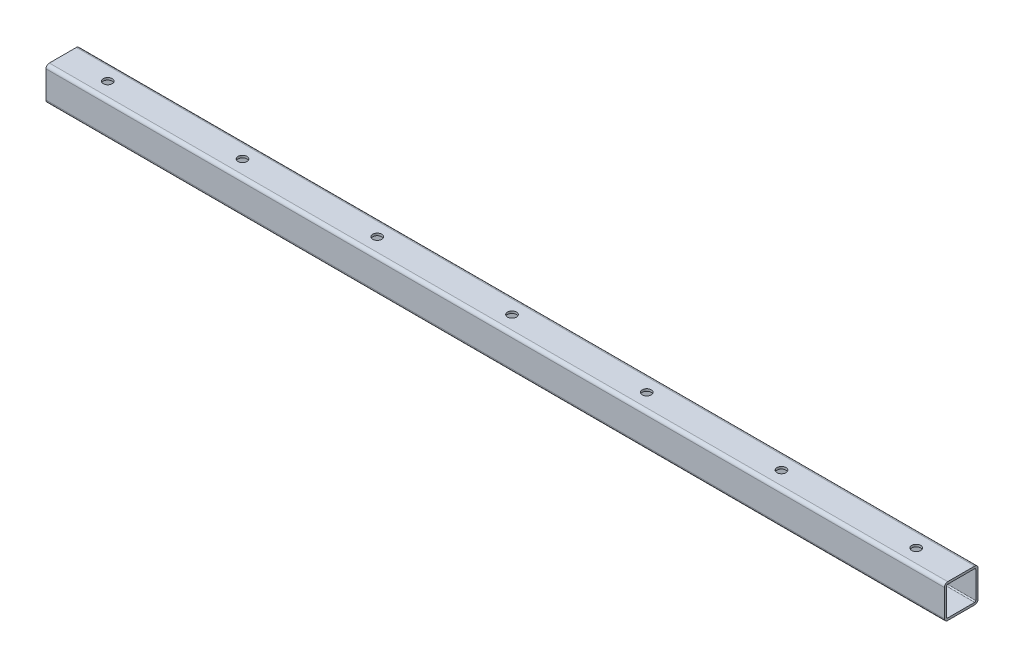
ISO-10303-21;
HEADER;
FILE_DESCRIPTION(('STEP AP214'),'2;1');
FILE_NAME('part.step','',(''),(''),'','','');
FILE_SCHEMA(('AUTOMOTIVE_DESIGN { 1 0 10303 214 1 1 1 1 }'));
ENDSEC;
DATA;
#1=APPLICATION_CONTEXT('core data for automotive mechanical design processes');
#2=APPLICATION_PROTOCOL_DEFINITION('international standard','automotive_design',2000,#1);
#3=PRODUCT_CONTEXT('',#1,'mechanical');
#4=PRODUCT('Part','Part','',(#3));
#5=PRODUCT_RELATED_PRODUCT_CATEGORY('part','',(#4));
#6=PRODUCT_DEFINITION_FORMATION('','',#4);
#7=PRODUCT_DEFINITION_CONTEXT('part definition',#1,'design');
#8=PRODUCT_DEFINITION('design','',#6,#7);
#9=PRODUCT_DEFINITION_SHAPE('','',#8);
#10=(LENGTH_UNIT() NAMED_UNIT(*) SI_UNIT(.MILLI.,.METRE.));
#11=(NAMED_UNIT(*) PLANE_ANGLE_UNIT() SI_UNIT($,.RADIAN.));
#12=(NAMED_UNIT(*) SI_UNIT($,.STERADIAN.) SOLID_ANGLE_UNIT());
#13=UNCERTAINTY_MEASURE_WITH_UNIT(LENGTH_MEASURE(1.E-05),#10,'distance_accuracy_value','');
#14=(GEOMETRIC_REPRESENTATION_CONTEXT(3) GLOBAL_UNCERTAINTY_ASSIGNED_CONTEXT((#13)) GLOBAL_UNIT_ASSIGNED_CONTEXT((#10,
#11,#12)) REPRESENTATION_CONTEXT('',''));
#15=CARTESIAN_POINT('',(0.,0.,0.));
#16=DIRECTION('',(0.,0.,1.));
#17=DIRECTION('',(1.,0.,0.));
#18=AXIS2_PLACEMENT_3D('',#15,#16,#17);
#19=CARTESIAN_POINT('',(200.,-6.,-6.));
#20=DIRECTION('',(-1.,0.,0.));
#21=DIRECTION('',(0.,0.,1.));
#22=AXIS2_PLACEMENT_3D('',#19,#20,#21);
#23=PLANE('',#22);
#24=CARTESIAN_POINT('',(200.,-6.,-6.));
#25=DIRECTION('',(1.,0.,0.));
#26=DIRECTION('',(0.,0.,1.));
#27=AXIS2_PLACEMENT_3D('',#24,#25,#26);
#28=CIRCLE('',#27,1.5);
#29=CARTESIAN_POINT('',(200.,-7.5,-5.99999999999999));
#30=VERTEX_POINT('',#29);
#31=CARTESIAN_POINT('',(200.,-5.99999999999999,-7.5));
#32=VERTEX_POINT('',#31);
#33=EDGE_CURVE('E216',#30,#32,#28,.T.);
#34=ORIENTED_EDGE('',*,*,#33,.T.);
#35=DIRECTION('',(0.,1.,0.));
#36=VECTOR('',#35,1.);
#37=CARTESIAN_POINT('',(200.,5.99999999999999,-7.5));
#38=LINE('',#37,#36);
#39=CARTESIAN_POINT('',(200.,5.99999999999999,-7.5));
#40=VERTEX_POINT('',#39);
#41=EDGE_CURVE('E219',#32,#40,#38,.T.);
#42=ORIENTED_EDGE('',*,*,#41,.T.);
#43=CARTESIAN_POINT('',(200.,6.,-6.));
#44=DIRECTION('',(1.,0.,0.));
#45=DIRECTION('',(0.,0.,1.));
#46=AXIS2_PLACEMENT_3D('',#43,#44,#45);
#47=CIRCLE('',#46,1.5);
#48=CARTESIAN_POINT('',(200.,7.5,-5.99999999999999));
#49=VERTEX_POINT('',#48);
#50=EDGE_CURVE('E222',#40,#49,#47,.T.);
#51=ORIENTED_EDGE('',*,*,#50,.T.);
#52=DIRECTION('',(0.,0.,1.));
#53=VECTOR('',#52,1.);
#54=CARTESIAN_POINT('',(200.,7.5,-5.99999999999999));
#55=LINE('',#54,#53);
#56=CARTESIAN_POINT('',(200.,7.5,5.99999999999999));
#57=VERTEX_POINT('',#56);
#58=EDGE_CURVE('E224',#49,#57,#55,.T.);
#59=ORIENTED_EDGE('',*,*,#58,.T.);
#60=CARTESIAN_POINT('',(200.,6.,6.));
#61=DIRECTION('',(1.,0.,0.));
#62=DIRECTION('',(0.,0.,-1.));
#63=AXIS2_PLACEMENT_3D('',#60,#61,#62);
#64=CIRCLE('',#63,1.5);
#65=CARTESIAN_POINT('',(200.,5.99999999999999,7.5));
#66=VERTEX_POINT('',#65);
#67=EDGE_CURVE('E226',#57,#66,#64,.T.);
#68=ORIENTED_EDGE('',*,*,#67,.T.);
#69=DIRECTION('',(0.,-1.,0.));
#70=VECTOR('',#69,1.);
#71=CARTESIAN_POINT('',(200.,5.99999999999999,7.5));
#72=LINE('',#71,#70);
#73=CARTESIAN_POINT('',(200.,-5.99999999999999,7.5));
#74=VERTEX_POINT('',#73);
#75=EDGE_CURVE('E228',#66,#74,#72,.T.);
#76=ORIENTED_EDGE('',*,*,#75,.T.);
#77=CARTESIAN_POINT('',(200.,-6.,6.));
#78=DIRECTION('',(1.,0.,0.));
#79=DIRECTION('',(0.,0.,1.));
#80=AXIS2_PLACEMENT_3D('',#77,#78,#79);
#81=CIRCLE('',#80,1.5);
#82=CARTESIAN_POINT('',(200.,-7.5,5.99999999999999));
#83=VERTEX_POINT('',#82);
#84=EDGE_CURVE('E230',#74,#83,#81,.T.);
#85=ORIENTED_EDGE('',*,*,#84,.T.);
#86=DIRECTION('',(0.,0.,-1.));
#87=VECTOR('',#86,1.);
#88=CARTESIAN_POINT('',(200.,-7.5,-5.99999999999999));
#89=LINE('',#88,#87);
#90=EDGE_CURVE('E232',#83,#30,#89,.T.);
#91=ORIENTED_EDGE('',*,*,#90,.T.);
#92=EDGE_LOOP('',(#34,#42,#51,#59,#68,#76,#85,#91));
#93=FACE_BOUND('',#92,.T.);
#94=CARTESIAN_POINT('',(200.,6.,-6.));
#95=DIRECTION('',(1.,0.,0.));
#96=DIRECTION('',(0.,0.,1.));
#97=AXIS2_PLACEMENT_3D('',#94,#95,#96);
#98=CIRCLE('',#97,0.5);
#99=CARTESIAN_POINT('',(200.,5.99999999999999,-6.5));
#100=VERTEX_POINT('',#99);
#101=CARTESIAN_POINT('',(200.,6.5,-5.99999999999999));
#102=VERTEX_POINT('',#101);
#103=EDGE_CURVE('E149',#100,#102,#98,.T.);
#104=ORIENTED_EDGE('',*,*,#103,.F.);
#105=DIRECTION('',(0.,1.,0.));
#106=VECTOR('',#105,1.);
#107=CARTESIAN_POINT('',(200.,5.99999999999999,-6.5));
#108=LINE('',#107,#106);
#109=CARTESIAN_POINT('',(200.,-6.,-6.5));
#110=VERTEX_POINT('',#109);
#111=EDGE_CURVE('E183',#110,#100,#108,.T.);
#112=ORIENTED_EDGE('',*,*,#111,.F.);
#113=CARTESIAN_POINT('',(200.,-6.,-6.));
#114=DIRECTION('',(1.,0.,0.));
#115=DIRECTION('',(0.,0.,1.));
#116=AXIS2_PLACEMENT_3D('',#113,#114,#115);
#117=CIRCLE('',#116,0.5);
#118=CARTESIAN_POINT('',(200.,-6.5,-5.99999999999999));
#119=VERTEX_POINT('',#118);
#120=EDGE_CURVE('E181',#119,#110,#117,.T.);
#121=ORIENTED_EDGE('',*,*,#120,.F.);
#122=DIRECTION('',(0.,0.,-1.));
#123=VECTOR('',#122,1.);
#124=CARTESIAN_POINT('',(200.,-6.5,-5.99999999999999));
#125=LINE('',#124,#123);
#126=CARTESIAN_POINT('',(200.,-6.5,5.99999999999999));
#127=VERTEX_POINT('',#126);
#128=EDGE_CURVE('E179',#127,#119,#125,.T.);
#129=ORIENTED_EDGE('',*,*,#128,.F.);
#130=CARTESIAN_POINT('',(200.,-6.,6.));
#131=DIRECTION('',(1.,0.,0.));
#132=DIRECTION('',(0.,0.,1.));
#133=AXIS2_PLACEMENT_3D('',#130,#131,#132);
#134=CIRCLE('',#133,0.5);
#135=CARTESIAN_POINT('',(200.,-5.99999999999999,6.5));
#136=VERTEX_POINT('',#135);
#137=EDGE_CURVE('E177',#136,#127,#134,.T.);
#138=ORIENTED_EDGE('',*,*,#137,.F.);
#139=DIRECTION('',(0.,-1.,0.));
#140=VECTOR('',#139,1.);
#141=CARTESIAN_POINT('',(200.,5.99999999999999,6.5));
#142=LINE('',#141,#140);
#143=CARTESIAN_POINT('',(200.,5.99999999999999,6.5));
#144=VERTEX_POINT('',#143);
#145=EDGE_CURVE('E172',#144,#136,#142,.T.);
#146=ORIENTED_EDGE('',*,*,#145,.F.);
#147=CARTESIAN_POINT('',(200.,6.,6.));
#148=DIRECTION('',(1.,0.,0.));
#149=DIRECTION('',(0.,0.,-1.));
#150=AXIS2_PLACEMENT_3D('',#147,#148,#149);
#151=CIRCLE('',#150,0.5);
#152=CARTESIAN_POINT('',(200.,6.5,5.99999999999999));
#153=VERTEX_POINT('',#152);
#154=EDGE_CURVE('E170',#153,#144,#151,.T.);
#155=ORIENTED_EDGE('',*,*,#154,.F.);
#156=DIRECTION('',(0.,0.,1.));
#157=VECTOR('',#156,1.);
#158=CARTESIAN_POINT('',(200.,6.5,-5.99999999999999));
#159=LINE('',#158,#157);
#160=EDGE_CURVE('E157',#102,#153,#159,.T.);
#161=ORIENTED_EDGE('',*,*,#160,.F.);
#162=EDGE_LOOP('',(#104,#112,#121,#129,#138,#146,#155,#161));
#163=FACE_BOUND('',#162,.T.);
#164=ADVANCED_FACE('F34',(#93,#163),#23,.F.);
#165=CARTESIAN_POINT('',(-200.,-6.,-6.));
#166=DIRECTION('',(-1.,0.,0.));
#167=DIRECTION('',(0.,0.,1.));
#168=AXIS2_PLACEMENT_3D('',#165,#166,#167);
#169=PLANE('',#168);
#170=CARTESIAN_POINT('',(-200.,-6.,-6.));
#171=DIRECTION('',(1.,0.,0.));
#172=DIRECTION('',(0.,0.,1.));
#173=AXIS2_PLACEMENT_3D('',#170,#171,#172);
#174=CIRCLE('',#173,1.5);
#175=CARTESIAN_POINT('',(-200.,-7.5,-5.99999999999999));
#176=VERTEX_POINT('',#175);
#177=CARTESIAN_POINT('',(-200.,-5.99999999999999,-7.5));
#178=VERTEX_POINT('',#177);
#179=EDGE_CURVE('E165',#176,#178,#174,.T.);
#180=ORIENTED_EDGE('',*,*,#179,.F.);
#181=DIRECTION('',(0.,0.,-1.));
#182=VECTOR('',#181,1.);
#183=CARTESIAN_POINT('',(-200.,-7.5,-5.99999999999999));
#184=LINE('',#183,#182);
#185=CARTESIAN_POINT('',(-200.,-7.5,5.99999999999999));
#186=VERTEX_POINT('',#185);
#187=EDGE_CURVE('E220',#186,#176,#184,.T.);
#188=ORIENTED_EDGE('',*,*,#187,.F.);
#189=CARTESIAN_POINT('',(-200.,-6.,6.));
#190=DIRECTION('',(1.,0.,0.));
#191=DIRECTION('',(0.,0.,1.));
#192=AXIS2_PLACEMENT_3D('',#189,#190,#191);
#193=CIRCLE('',#192,1.5);
#194=CARTESIAN_POINT('',(-200.,-5.99999999999999,7.5));
#195=VERTEX_POINT('',#194);
#196=EDGE_CURVE('E247',#195,#186,#193,.T.);
#197=ORIENTED_EDGE('',*,*,#196,.F.);
#198=DIRECTION('',(0.,-1.,0.));
#199=VECTOR('',#198,1.);
#200=CARTESIAN_POINT('',(-200.,5.99999999999999,7.5));
#201=LINE('',#200,#199);
#202=CARTESIAN_POINT('',(-200.,5.99999999999999,7.5));
#203=VERTEX_POINT('',#202);
#204=EDGE_CURVE('E245',#203,#195,#201,.T.);
#205=ORIENTED_EDGE('',*,*,#204,.F.);
#206=CARTESIAN_POINT('',(-200.,6.,6.));
#207=DIRECTION('',(1.,0.,0.));
#208=DIRECTION('',(0.,0.,-1.));
#209=AXIS2_PLACEMENT_3D('',#206,#207,#208);
#210=CIRCLE('',#209,1.5);
#211=CARTESIAN_POINT('',(-200.,7.5,5.99999999999999));
#212=VERTEX_POINT('',#211);
#213=EDGE_CURVE('E243',#212,#203,#210,.T.);
#214=ORIENTED_EDGE('',*,*,#213,.F.);
#215=DIRECTION('',(0.,0.,1.));
#216=VECTOR('',#215,1.);
#217=CARTESIAN_POINT('',(-200.,7.5,-5.99999999999999));
#218=LINE('',#217,#216);
#219=CARTESIAN_POINT('',(-200.,7.5,-5.99999999999999));
#220=VERTEX_POINT('',#219);
#221=EDGE_CURVE('E241',#220,#212,#218,.T.);
#222=ORIENTED_EDGE('',*,*,#221,.F.);
#223=CARTESIAN_POINT('',(-200.,6.,-6.));
#224=DIRECTION('',(1.,0.,0.));
#225=DIRECTION('',(0.,0.,1.));
#226=AXIS2_PLACEMENT_3D('',#223,#224,#225);
#227=CIRCLE('',#226,1.5);
#228=CARTESIAN_POINT('',(-200.,5.99999999999999,-7.5));
#229=VERTEX_POINT('',#228);
#230=EDGE_CURVE('E239',#229,#220,#227,.T.);
#231=ORIENTED_EDGE('',*,*,#230,.F.);
#232=DIRECTION('',(0.,1.,0.));
#233=VECTOR('',#232,1.);
#234=CARTESIAN_POINT('',(-200.,5.99999999999999,-7.5));
#235=LINE('',#234,#233);
#236=EDGE_CURVE('E237',#178,#229,#235,.T.);
#237=ORIENTED_EDGE('',*,*,#236,.F.);
#238=EDGE_LOOP('',(#180,#188,#197,#205,#214,#222,#231,#237));
#239=FACE_BOUND('',#238,.T.);
#240=DIRECTION('',(0.,1.,0.));
#241=VECTOR('',#240,1.);
#242=CARTESIAN_POINT('',(-200.,5.99999999999999,-6.5));
#243=LINE('',#242,#241);
#244=CARTESIAN_POINT('',(-200.,-6.,-6.5));
#245=VERTEX_POINT('',#244);
#246=CARTESIAN_POINT('',(-200.,5.99999999999999,-6.5));
#247=VERTEX_POINT('',#246);
#248=EDGE_CURVE('E158',#245,#247,#243,.T.);
#249=ORIENTED_EDGE('',*,*,#248,.T.);
#250=CARTESIAN_POINT('',(-200.,6.,-6.));
#251=DIRECTION('',(1.,0.,0.));
#252=DIRECTION('',(0.,0.,1.));
#253=AXIS2_PLACEMENT_3D('',#250,#251,#252);
#254=CIRCLE('',#253,0.5);
#255=CARTESIAN_POINT('',(-200.,6.5,-5.99999999999999));
#256=VERTEX_POINT('',#255);
#257=EDGE_CURVE('E59',#247,#256,#254,.T.);
#258=ORIENTED_EDGE('',*,*,#257,.T.);
#259=DIRECTION('',(0.,0.,1.));
#260=VECTOR('',#259,1.);
#261=CARTESIAN_POINT('',(-200.,6.5,-5.99999999999999));
#262=LINE('',#261,#260);
#263=CARTESIAN_POINT('',(-200.,6.5,5.99999999999999));
#264=VERTEX_POINT('',#263);
#265=EDGE_CURVE('E164',#256,#264,#262,.T.);
#266=ORIENTED_EDGE('',*,*,#265,.T.);
#267=CARTESIAN_POINT('',(-200.,6.,6.));
#268=DIRECTION('',(1.,0.,0.));
#269=DIRECTION('',(0.,0.,-1.));
#270=AXIS2_PLACEMENT_3D('',#267,#268,#269);
#271=CIRCLE('',#270,0.5);
#272=CARTESIAN_POINT('',(-200.,5.99999999999999,6.5));
#273=VERTEX_POINT('',#272);
#274=EDGE_CURVE('E188',#264,#273,#271,.T.);
#275=ORIENTED_EDGE('',*,*,#274,.T.);
#276=DIRECTION('',(0.,-1.,0.));
#277=VECTOR('',#276,1.);
#278=CARTESIAN_POINT('',(-200.,5.99999999999999,6.5));
#279=LINE('',#278,#277);
#280=CARTESIAN_POINT('',(-200.,-5.99999999999999,6.5));
#281=VERTEX_POINT('',#280);
#282=EDGE_CURVE('E191',#273,#281,#279,.T.);
#283=ORIENTED_EDGE('',*,*,#282,.T.);
#284=CARTESIAN_POINT('',(-200.,-6.,6.));
#285=DIRECTION('',(1.,0.,0.));
#286=DIRECTION('',(0.,0.,1.));
#287=AXIS2_PLACEMENT_3D('',#284,#285,#286);
#288=CIRCLE('',#287,0.5);
#289=CARTESIAN_POINT('',(-200.,-6.5,5.99999999999999));
#290=VERTEX_POINT('',#289);
#291=EDGE_CURVE('E194',#281,#290,#288,.T.);
#292=ORIENTED_EDGE('',*,*,#291,.T.);
#293=DIRECTION('',(0.,0.,-1.));
#294=VECTOR('',#293,1.);
#295=CARTESIAN_POINT('',(-200.,-6.5,-5.99999999999999));
#296=LINE('',#295,#294);
#297=CARTESIAN_POINT('',(-200.,-6.5,-5.99999999999999));
#298=VERTEX_POINT('',#297);
#299=EDGE_CURVE('E197',#290,#298,#296,.T.);
#300=ORIENTED_EDGE('',*,*,#299,.T.);
#301=CARTESIAN_POINT('',(-200.,-6.,-6.));
#302=DIRECTION('',(1.,0.,0.));
#303=DIRECTION('',(0.,0.,1.));
#304=AXIS2_PLACEMENT_3D('',#301,#302,#303);
#305=CIRCLE('',#304,0.5);
#306=EDGE_CURVE('E200',#298,#245,#305,.T.);
#307=ORIENTED_EDGE('',*,*,#306,.T.);
#308=EDGE_LOOP('',(#249,#258,#266,#275,#283,#292,#300,#307));
#309=FACE_BOUND('',#308,.T.);
#310=ADVANCED_FACE('F335',(#239,#309),#169,.T.);
#311=CARTESIAN_POINT('',(200.,-6.,-6.));
#312=DIRECTION('',(-1.,0.,0.));
#313=DIRECTION('',(0.,0.,1.));
#314=AXIS2_PLACEMENT_3D('',#311,#312,#313);
#315=CYLINDRICAL_SURFACE('',#314,1.5);
#316=ORIENTED_EDGE('',*,*,#179,.T.);
#317=DIRECTION('',(-1.,0.,0.));
#318=VECTOR('',#317,1.);
#319=CARTESIAN_POINT('',(200.,-5.99999999999999,-7.5));
#320=LINE('',#319,#318);
#321=EDGE_CURVE('E11',#32,#178,#320,.T.);
#322=ORIENTED_EDGE('',*,*,#321,.F.);
#323=ORIENTED_EDGE('',*,*,#33,.F.);
#324=DIRECTION('',(-1.,0.,0.));
#325=VECTOR('',#324,1.);
#326=CARTESIAN_POINT('',(200.,-7.5,-5.99999999999999));
#327=LINE('',#326,#325);
#328=EDGE_CURVE('E234',#30,#176,#327,.T.);
#329=ORIENTED_EDGE('',*,*,#328,.T.);
#330=EDGE_LOOP('',(#316,#322,#323,#329));
#331=FACE_BOUND('',#330,.T.);
#332=ADVANCED_FACE('F36',(#331),#315,.T.);
#333=CARTESIAN_POINT('',(200.,5.99999999999999,-7.5));
#334=DIRECTION('',(0.,0.,1.));
#335=DIRECTION('',(0.,-1.,0.));
#336=AXIS2_PLACEMENT_3D('',#333,#334,#335);
#337=PLANE('',#336);
#338=ORIENTED_EDGE('',*,*,#236,.T.);
#339=DIRECTION('',(-1.,0.,0.));
#340=VECTOR('',#339,1.);
#341=CARTESIAN_POINT('',(200.,5.99999999999999,-7.5));
#342=LINE('',#341,#340);
#343=EDGE_CURVE('E43',#40,#229,#342,.T.);
#344=ORIENTED_EDGE('',*,*,#343,.F.);
#345=ORIENTED_EDGE('',*,*,#41,.F.);
#346=ORIENTED_EDGE('',*,*,#321,.T.);
#347=EDGE_LOOP('',(#338,#344,#345,#346));
#348=FACE_BOUND('',#347,.T.);
#349=ADVANCED_FACE('F388',(#348),#337,.F.);
#350=CARTESIAN_POINT('',(200.,6.,-6.));
#351=DIRECTION('',(-1.,0.,0.));
#352=DIRECTION('',(0.,0.,1.));
#353=AXIS2_PLACEMENT_3D('',#350,#351,#352);
#354=CYLINDRICAL_SURFACE('',#353,1.5);
#355=ORIENTED_EDGE('',*,*,#230,.T.);
#356=DIRECTION('',(-1.,0.,0.));
#357=VECTOR('',#356,1.);
#358=CARTESIAN_POINT('',(200.,7.5,-5.99999999999999));
#359=LINE('',#358,#357);
#360=EDGE_CURVE('E264',#49,#220,#359,.T.);
#361=ORIENTED_EDGE('',*,*,#360,.F.);
#362=ORIENTED_EDGE('',*,*,#50,.F.);
#363=ORIENTED_EDGE('',*,*,#343,.T.);
#364=EDGE_LOOP('',(#355,#361,#362,#363));
#365=FACE_BOUND('',#364,.T.);
#366=ADVANCED_FACE('F385',(#365),#354,.T.);
#367=CARTESIAN_POINT('',(200.,7.5,-5.99999999999999));
#368=DIRECTION('',(0.,-1.,0.));
#369=DIRECTION('',(0.,0.,-1.));
#370=AXIS2_PLACEMENT_3D('',#367,#368,#369);
#371=PLANE('',#370);
#372=CARTESIAN_POINT('',(-180.,7.5,0.));
#373=DIRECTION('',(0.,1.,0.));
#374=DIRECTION('',(0.,0.,1.));
#375=AXIS2_PLACEMENT_3D('',#372,#373,#374);
#376=CIRCLE('',#375,2.);
#377=CARTESIAN_POINT('',(-180.,7.5,2.));
#378=VERTEX_POINT('',#377);
#379=EDGE_CURVE('E647',#378,#378,#376,.T.);
#380=ORIENTED_EDGE('',*,*,#379,.F.);
#381=EDGE_LOOP('',(#380));
#382=FACE_BOUND('',#381,.T.);
#383=CARTESIAN_POINT('',(-120.,7.5,0.));
#384=DIRECTION('',(0.,1.,0.));
#385=DIRECTION('',(0.,0.,1.));
#386=AXIS2_PLACEMENT_3D('',#383,#384,#385);
#387=CIRCLE('',#386,2.);
#388=CARTESIAN_POINT('',(-120.,7.5,2.));
#389=VERTEX_POINT('',#388);
#390=EDGE_CURVE('E653',#389,#389,#387,.T.);
#391=ORIENTED_EDGE('',*,*,#390,.F.);
#392=EDGE_LOOP('',(#391));
#393=FACE_BOUND('',#392,.T.);
#394=CARTESIAN_POINT('',(-60.,7.5,0.));
#395=DIRECTION('',(0.,1.,0.));
#396=DIRECTION('',(0.,0.,1.));
#397=AXIS2_PLACEMENT_3D('',#394,#395,#396);
#398=CIRCLE('',#397,2.);
#399=CARTESIAN_POINT('',(-60.,7.5,2.));
#400=VERTEX_POINT('',#399);
#401=EDGE_CURVE('E659',#400,#400,#398,.T.);
#402=ORIENTED_EDGE('',*,*,#401,.F.);
#403=EDGE_LOOP('',(#402));
#404=FACE_BOUND('',#403,.T.);
#405=CARTESIAN_POINT('',(0.,7.5,0.));
#406=DIRECTION('',(0.,1.,0.));
#407=DIRECTION('',(0.,0.,1.));
#408=AXIS2_PLACEMENT_3D('',#405,#406,#407);
#409=CIRCLE('',#408,2.);
#410=CARTESIAN_POINT('',(0.,7.5,2.));
#411=VERTEX_POINT('',#410);
#412=EDGE_CURVE('E665',#411,#411,#409,.T.);
#413=ORIENTED_EDGE('',*,*,#412,.F.);
#414=EDGE_LOOP('',(#413));
#415=FACE_BOUND('',#414,.T.);
#416=CARTESIAN_POINT('',(60.,7.5,0.));
#417=DIRECTION('',(0.,1.,0.));
#418=DIRECTION('',(0.,0.,1.));
#419=AXIS2_PLACEMENT_3D('',#416,#417,#418);
#420=CIRCLE('',#419,2.);
#421=CARTESIAN_POINT('',(60.,7.5,2.));
#422=VERTEX_POINT('',#421);
#423=EDGE_CURVE('E671',#422,#422,#420,.T.);
#424=ORIENTED_EDGE('',*,*,#423,.F.);
#425=EDGE_LOOP('',(#424));
#426=FACE_BOUND('',#425,.T.);
#427=CARTESIAN_POINT('',(120.,7.5,0.));
#428=DIRECTION('',(0.,1.,0.));
#429=DIRECTION('',(0.,0.,1.));
#430=AXIS2_PLACEMENT_3D('',#427,#428,#429);
#431=CIRCLE('',#430,2.);
#432=CARTESIAN_POINT('',(120.,7.5,2.));
#433=VERTEX_POINT('',#432);
#434=EDGE_CURVE('E677',#433,#433,#431,.T.);
#435=ORIENTED_EDGE('',*,*,#434,.F.);
#436=EDGE_LOOP('',(#435));
#437=FACE_BOUND('',#436,.T.);
#438=CARTESIAN_POINT('',(180.,7.5,0.));
#439=DIRECTION('',(0.,1.,0.));
#440=DIRECTION('',(0.,0.,1.));
#441=AXIS2_PLACEMENT_3D('',#438,#439,#440);
#442=CIRCLE('',#441,2.);
#443=CARTESIAN_POINT('',(180.,7.5,2.));
#444=VERTEX_POINT('',#443);
#445=EDGE_CURVE('E683',#444,#444,#442,.T.);
#446=ORIENTED_EDGE('',*,*,#445,.F.);
#447=EDGE_LOOP('',(#446));
#448=FACE_BOUND('',#447,.T.);
#449=ORIENTED_EDGE('',*,*,#221,.T.);
#450=DIRECTION('',(-1.,0.,0.));
#451=VECTOR('',#450,1.);
#452=CARTESIAN_POINT('',(200.,7.5,5.99999999999999));
#453=LINE('',#452,#451);
#454=EDGE_CURVE('E261',#57,#212,#453,.T.);
#455=ORIENTED_EDGE('',*,*,#454,.F.);
#456=ORIENTED_EDGE('',*,*,#58,.F.);
#457=ORIENTED_EDGE('',*,*,#360,.T.);
#458=EDGE_LOOP('',(#449,#455,#456,#457));
#459=FACE_BOUND('',#458,.T.);
#460=ADVANCED_FACE('F381',(#382,#393,#404,#415,#426,#437,#448,#459),#371,.F.);
#461=CARTESIAN_POINT('',(200.,6.,6.));
#462=DIRECTION('',(-1.,0.,0.));
#463=DIRECTION('',(0.,0.,1.));
#464=AXIS2_PLACEMENT_3D('',#461,#462,#463);
#465=CYLINDRICAL_SURFACE('',#464,1.5);
#466=ORIENTED_EDGE('',*,*,#213,.T.);
#467=DIRECTION('',(-1.,0.,0.));
#468=VECTOR('',#467,1.);
#469=CARTESIAN_POINT('',(200.,5.99999999999999,7.5));
#470=LINE('',#469,#468);
#471=EDGE_CURVE('E258',#66,#203,#470,.T.);
#472=ORIENTED_EDGE('',*,*,#471,.F.);
#473=ORIENTED_EDGE('',*,*,#67,.F.);
#474=ORIENTED_EDGE('',*,*,#454,.T.);
#475=EDGE_LOOP('',(#466,#472,#473,#474));
#476=FACE_BOUND('',#475,.T.);
#477=ADVANCED_FACE('F377',(#476),#465,.T.);
#478=CARTESIAN_POINT('',(200.,5.99999999999999,7.5));
#479=DIRECTION('',(0.,0.,-1.));
#480=DIRECTION('',(-1.,0.,0.));
#481=AXIS2_PLACEMENT_3D('',#478,#479,#480);
#482=PLANE('',#481);
#483=ORIENTED_EDGE('',*,*,#204,.T.);
#484=DIRECTION('',(-1.,0.,0.));
#485=VECTOR('',#484,1.);
#486=CARTESIAN_POINT('',(200.,-5.99999999999999,7.5));
#487=LINE('',#486,#485);
#488=EDGE_CURVE('E255',#74,#195,#487,.T.);
#489=ORIENTED_EDGE('',*,*,#488,.F.);
#490=ORIENTED_EDGE('',*,*,#75,.F.);
#491=ORIENTED_EDGE('',*,*,#471,.T.);
#492=EDGE_LOOP('',(#483,#489,#490,#491));
#493=FACE_BOUND('',#492,.T.);
#494=ADVANCED_FACE('F373',(#493),#482,.F.);
#495=CARTESIAN_POINT('',(200.,-6.,6.));
#496=DIRECTION('',(-1.,0.,0.));
#497=DIRECTION('',(0.,0.,1.));
#498=AXIS2_PLACEMENT_3D('',#495,#496,#497);
#499=CYLINDRICAL_SURFACE('',#498,1.5);
#500=ORIENTED_EDGE('',*,*,#196,.T.);
#501=DIRECTION('',(-1.,0.,0.));
#502=VECTOR('',#501,1.);
#503=CARTESIAN_POINT('',(200.,-7.5,5.99999999999999));
#504=LINE('',#503,#502);
#505=EDGE_CURVE('E252',#83,#186,#504,.T.);
#506=ORIENTED_EDGE('',*,*,#505,.F.);
#507=ORIENTED_EDGE('',*,*,#84,.F.);
#508=ORIENTED_EDGE('',*,*,#488,.T.);
#509=EDGE_LOOP('',(#500,#506,#507,#508));
#510=FACE_BOUND('',#509,.T.);
#511=ADVANCED_FACE('F369',(#510),#499,.T.);
#512=CARTESIAN_POINT('',(200.,-7.5,-5.99999999999999));
#513=DIRECTION('',(0.,1.,0.));
#514=DIRECTION('',(0.,0.,1.));
#515=AXIS2_PLACEMENT_3D('',#512,#513,#514);
#516=PLANE('',#515);
#517=CARTESIAN_POINT('',(-180.,-7.5,0.));
#518=DIRECTION('',(0.,1.,0.));
#519=DIRECTION('',(0.,0.,1.));
#520=AXIS2_PLACEMENT_3D('',#517,#518,#519);
#521=CIRCLE('',#520,2.);
#522=CARTESIAN_POINT('',(-180.,-7.5,2.));
#523=VERTEX_POINT('',#522);
#524=EDGE_CURVE('E273',#523,#523,#521,.T.);
#525=ORIENTED_EDGE('',*,*,#524,.T.);
#526=EDGE_LOOP('',(#525));
#527=FACE_BOUND('',#526,.T.);
#528=CARTESIAN_POINT('',(-120.,-7.5,0.));
#529=DIRECTION('',(0.,1.,0.));
#530=DIRECTION('',(0.,0.,1.));
#531=AXIS2_PLACEMENT_3D('',#528,#529,#530);
#532=CIRCLE('',#531,2.);
#533=CARTESIAN_POINT('',(-120.,-7.5,2.));
#534=VERTEX_POINT('',#533);
#535=EDGE_CURVE('E648',#534,#534,#532,.T.);
#536=ORIENTED_EDGE('',*,*,#535,.T.);
#537=EDGE_LOOP('',(#536));
#538=FACE_BOUND('',#537,.T.);
#539=CARTESIAN_POINT('',(-60.,-7.5,0.));
#540=DIRECTION('',(0.,1.,0.));
#541=DIRECTION('',(0.,0.,1.));
#542=AXIS2_PLACEMENT_3D('',#539,#540,#541);
#543=CIRCLE('',#542,2.);
#544=CARTESIAN_POINT('',(-60.,-7.5,2.));
#545=VERTEX_POINT('',#544);
#546=EDGE_CURVE('E657',#545,#545,#543,.T.);
#547=ORIENTED_EDGE('',*,*,#546,.T.);
#548=EDGE_LOOP('',(#547));
#549=FACE_BOUND('',#548,.T.);
#550=CARTESIAN_POINT('',(0.,-7.5,0.));
#551=DIRECTION('',(0.,1.,0.));
#552=DIRECTION('',(0.,0.,1.));
#553=AXIS2_PLACEMENT_3D('',#550,#551,#552);
#554=CIRCLE('',#553,2.);
#555=CARTESIAN_POINT('',(0.,-7.5,2.));
#556=VERTEX_POINT('',#555);
#557=EDGE_CURVE('E662',#556,#556,#554,.T.);
#558=ORIENTED_EDGE('',*,*,#557,.T.);
#559=EDGE_LOOP('',(#558));
#560=FACE_BOUND('',#559,.T.);
#561=CARTESIAN_POINT('',(60.,-7.5,0.));
#562=DIRECTION('',(0.,1.,0.));
#563=DIRECTION('',(0.,0.,1.));
#564=AXIS2_PLACEMENT_3D('',#561,#562,#563);
#565=CIRCLE('',#564,2.);
#566=CARTESIAN_POINT('',(60.,-7.5,2.));
#567=VERTEX_POINT('',#566);
#568=EDGE_CURVE('E668',#567,#567,#565,.T.);
#569=ORIENTED_EDGE('',*,*,#568,.T.);
#570=EDGE_LOOP('',(#569));
#571=FACE_BOUND('',#570,.T.);
#572=CARTESIAN_POINT('',(120.,-7.5,0.));
#573=DIRECTION('',(0.,1.,0.));
#574=DIRECTION('',(0.,0.,1.));
#575=AXIS2_PLACEMENT_3D('',#572,#573,#574);
#576=CIRCLE('',#575,2.);
#577=CARTESIAN_POINT('',(120.,-7.5,2.));
#578=VERTEX_POINT('',#577);
#579=EDGE_CURVE('E674',#578,#578,#576,.T.);
#580=ORIENTED_EDGE('',*,*,#579,.T.);
#581=EDGE_LOOP('',(#580));
#582=FACE_BOUND('',#581,.T.);
#583=CARTESIAN_POINT('',(180.,-7.5,0.));
#584=DIRECTION('',(0.,1.,0.));
#585=DIRECTION('',(0.,0.,1.));
#586=AXIS2_PLACEMENT_3D('',#583,#584,#585);
#587=CIRCLE('',#586,2.);
#588=CARTESIAN_POINT('',(180.,-7.5,2.));
#589=VERTEX_POINT('',#588);
#590=EDGE_CURVE('E680',#589,#589,#587,.T.);
#591=ORIENTED_EDGE('',*,*,#590,.T.);
#592=EDGE_LOOP('',(#591));
#593=FACE_BOUND('',#592,.T.);
#594=ORIENTED_EDGE('',*,*,#187,.T.);
#595=ORIENTED_EDGE('',*,*,#328,.F.);
#596=ORIENTED_EDGE('',*,*,#90,.F.);
#597=ORIENTED_EDGE('',*,*,#505,.T.);
#598=EDGE_LOOP('',(#594,#595,#596,#597));
#599=FACE_BOUND('',#598,.T.);
#600=ADVANCED_FACE('F366',(#527,#538,#549,#560,#571,#582,#593,#599),#516,.F.);
#601=CARTESIAN_POINT('',(200.,6.,-6.));
#602=DIRECTION('',(-1.,0.,0.));
#603=DIRECTION('',(0.,0.,1.));
#604=AXIS2_PLACEMENT_3D('',#601,#602,#603);
#605=CYLINDRICAL_SURFACE('',#604,0.5);
#606=ORIENTED_EDGE('',*,*,#257,.F.);
#607=DIRECTION('',(-1.,0.,0.));
#608=VECTOR('',#607,1.);
#609=CARTESIAN_POINT('',(200.,5.99999999999999,-6.5));
#610=LINE('',#609,#608);
#611=EDGE_CURVE('E153',#100,#247,#610,.T.);
#612=ORIENTED_EDGE('',*,*,#611,.F.);
#613=ORIENTED_EDGE('',*,*,#103,.T.);
#614=DIRECTION('',(-1.,0.,0.));
#615=VECTOR('',#614,1.);
#616=CARTESIAN_POINT('',(200.,6.5,-5.99999999999999));
#617=LINE('',#616,#615);
#618=EDGE_CURVE('E152',#102,#256,#617,.T.);
#619=ORIENTED_EDGE('',*,*,#618,.T.);
#620=EDGE_LOOP('',(#606,#612,#613,#619));
#621=FACE_BOUND('',#620,.T.);
#622=ADVANCED_FACE('F151',(#621),#605,.F.);
#623=CARTESIAN_POINT('',(200.,6.5,-5.99999999999999));
#624=DIRECTION('',(0.,-1.,0.));
#625=DIRECTION('',(0.,0.,-1.));
#626=AXIS2_PLACEMENT_3D('',#623,#624,#625);
#627=PLANE('',#626);
#628=CARTESIAN_POINT('',(-180.,6.5,0.));
#629=DIRECTION('',(0.,-1.,0.));
#630=DIRECTION('',(0.,0.,-1.));
#631=AXIS2_PLACEMENT_3D('',#628,#629,#630);
#632=CIRCLE('',#631,2.);
#633=CARTESIAN_POINT('',(-180.,6.5,-2.));
#634=VERTEX_POINT('',#633);
#635=EDGE_CURVE('E186',#634,#634,#632,.T.);
#636=ORIENTED_EDGE('',*,*,#635,.F.);
#637=EDGE_LOOP('',(#636));
#638=FACE_BOUND('',#637,.T.);
#639=CARTESIAN_POINT('',(-120.,6.5,0.));
#640=DIRECTION('',(0.,-1.,0.));
#641=DIRECTION('',(0.,0.,-1.));
#642=AXIS2_PLACEMENT_3D('',#639,#640,#641);
#643=CIRCLE('',#642,2.);
#644=CARTESIAN_POINT('',(-120.,6.5,-2.));
#645=VERTEX_POINT('',#644);
#646=EDGE_CURVE('E291',#645,#645,#643,.T.);
#647=ORIENTED_EDGE('',*,*,#646,.F.);
#648=EDGE_LOOP('',(#647));
#649=FACE_BOUND('',#648,.T.);
#650=CARTESIAN_POINT('',(-60.,6.5,0.));
#651=DIRECTION('',(0.,-1.,0.));
#652=DIRECTION('',(0.,0.,-1.));
#653=AXIS2_PLACEMENT_3D('',#650,#651,#652);
#654=CIRCLE('',#653,2.);
#655=CARTESIAN_POINT('',(-60.,6.5,-2.));
#656=VERTEX_POINT('',#655);
#657=EDGE_CURVE('E288',#656,#656,#654,.T.);
#658=ORIENTED_EDGE('',*,*,#657,.F.);
#659=EDGE_LOOP('',(#658));
#660=FACE_BOUND('',#659,.T.);
#661=CARTESIAN_POINT('',(0.,6.5,0.));
#662=DIRECTION('',(0.,-1.,0.));
#663=DIRECTION('',(0.,0.,-1.));
#664=AXIS2_PLACEMENT_3D('',#661,#662,#663);
#665=CIRCLE('',#664,2.);
#666=CARTESIAN_POINT('',(0.,6.5,-2.));
#667=VERTEX_POINT('',#666);
#668=EDGE_CURVE('E285',#667,#667,#665,.T.);
#669=ORIENTED_EDGE('',*,*,#668,.F.);
#670=EDGE_LOOP('',(#669));
#671=FACE_BOUND('',#670,.T.);
#672=CARTESIAN_POINT('',(60.,6.5,0.));
#673=DIRECTION('',(0.,-1.,0.));
#674=DIRECTION('',(0.,0.,-1.));
#675=AXIS2_PLACEMENT_3D('',#672,#673,#674);
#676=CIRCLE('',#675,2.);
#677=CARTESIAN_POINT('',(60.,6.5,-2.));
#678=VERTEX_POINT('',#677);
#679=EDGE_CURVE('E281',#678,#678,#676,.T.);
#680=ORIENTED_EDGE('',*,*,#679,.F.);
#681=EDGE_LOOP('',(#680));
#682=FACE_BOUND('',#681,.T.);
#683=CARTESIAN_POINT('',(120.,6.5,0.));
#684=DIRECTION('',(0.,-1.,0.));
#685=DIRECTION('',(0.,0.,-1.));
#686=AXIS2_PLACEMENT_3D('',#683,#684,#685);
#687=CIRCLE('',#686,2.);
#688=CARTESIAN_POINT('',(120.,6.5,-2.));
#689=VERTEX_POINT('',#688);
#690=EDGE_CURVE('E277',#689,#689,#687,.T.);
#691=ORIENTED_EDGE('',*,*,#690,.F.);
#692=EDGE_LOOP('',(#691));
#693=FACE_BOUND('',#692,.T.);
#694=CARTESIAN_POINT('',(180.,6.5,0.));
#695=DIRECTION('',(0.,-1.,0.));
#696=DIRECTION('',(0.,0.,-1.));
#697=AXIS2_PLACEMENT_3D('',#694,#695,#696);
#698=CIRCLE('',#697,2.);
#699=CARTESIAN_POINT('',(180.,6.5,-2.));
#700=VERTEX_POINT('',#699);
#701=EDGE_CURVE('E272',#700,#700,#698,.T.);
#702=ORIENTED_EDGE('',*,*,#701,.F.);
#703=EDGE_LOOP('',(#702));
#704=FACE_BOUND('',#703,.T.);
#705=ORIENTED_EDGE('',*,*,#265,.F.);
#706=ORIENTED_EDGE('',*,*,#618,.F.);
#707=ORIENTED_EDGE('',*,*,#160,.T.);
#708=DIRECTION('',(-1.,0.,0.));
#709=VECTOR('',#708,1.);
#710=CARTESIAN_POINT('',(200.,6.5,5.99999999999999));
#711=LINE('',#710,#709);
#712=EDGE_CURVE('E166',#153,#264,#711,.T.);
#713=ORIENTED_EDGE('',*,*,#712,.T.);
#714=EDGE_LOOP('',(#705,#706,#707,#713));
#715=FACE_BOUND('',#714,.T.);
#716=ADVANCED_FACE('F161',(#638,#649,#660,#671,#682,#693,#704,#715),#627,.T.);
#717=CARTESIAN_POINT('',(200.,6.,6.));
#718=DIRECTION('',(-1.,0.,0.));
#719=DIRECTION('',(0.,0.,1.));
#720=AXIS2_PLACEMENT_3D('',#717,#718,#719);
#721=CYLINDRICAL_SURFACE('',#720,0.5);
#722=ORIENTED_EDGE('',*,*,#274,.F.);
#723=ORIENTED_EDGE('',*,*,#712,.F.);
#724=ORIENTED_EDGE('',*,*,#154,.T.);
#725=DIRECTION('',(-1.,0.,0.));
#726=VECTOR('',#725,1.);
#727=CARTESIAN_POINT('',(200.,5.99999999999999,6.5));
#728=LINE('',#727,#726);
#729=EDGE_CURVE('E213',#144,#273,#728,.T.);
#730=ORIENTED_EDGE('',*,*,#729,.T.);
#731=EDGE_LOOP('',(#722,#723,#724,#730));
#732=FACE_BOUND('',#731,.T.);
#733=ADVANCED_FACE('F483',(#732),#721,.F.);
#734=CARTESIAN_POINT('',(200.,5.99999999999999,6.5));
#735=DIRECTION('',(0.,0.,-1.));
#736=DIRECTION('',(-1.,0.,0.));
#737=AXIS2_PLACEMENT_3D('',#734,#735,#736);
#738=PLANE('',#737);
#739=ORIENTED_EDGE('',*,*,#282,.F.);
#740=ORIENTED_EDGE('',*,*,#729,.F.);
#741=ORIENTED_EDGE('',*,*,#145,.T.);
#742=DIRECTION('',(-1.,0.,0.));
#743=VECTOR('',#742,1.);
#744=CARTESIAN_POINT('',(200.,-5.99999999999999,6.5));
#745=LINE('',#744,#743);
#746=EDGE_CURVE('E211',#136,#281,#745,.T.);
#747=ORIENTED_EDGE('',*,*,#746,.T.);
#748=EDGE_LOOP('',(#739,#740,#741,#747));
#749=FACE_BOUND('',#748,.T.);
#750=ADVANCED_FACE('F491',(#749),#738,.T.);
#751=CARTESIAN_POINT('',(200.,-6.,6.));
#752=DIRECTION('',(-1.,0.,0.));
#753=DIRECTION('',(0.,0.,1.));
#754=AXIS2_PLACEMENT_3D('',#751,#752,#753);
#755=CYLINDRICAL_SURFACE('',#754,0.5);
#756=ORIENTED_EDGE('',*,*,#291,.F.);
#757=ORIENTED_EDGE('',*,*,#746,.F.);
#758=ORIENTED_EDGE('',*,*,#137,.T.);
#759=DIRECTION('',(-1.,0.,0.));
#760=VECTOR('',#759,1.);
#761=CARTESIAN_POINT('',(200.,-6.5,5.99999999999999));
#762=LINE('',#761,#760);
#763=EDGE_CURVE('E209',#127,#290,#762,.T.);
#764=ORIENTED_EDGE('',*,*,#763,.T.);
#765=EDGE_LOOP('',(#756,#757,#758,#764));
#766=FACE_BOUND('',#765,.T.);
#767=ADVANCED_FACE('F315',(#766),#755,.F.);
#768=CARTESIAN_POINT('',(200.,-6.5,-5.99999999999999));
#769=DIRECTION('',(0.,1.,0.));
#770=DIRECTION('',(0.,0.,1.));
#771=AXIS2_PLACEMENT_3D('',#768,#769,#770);
#772=PLANE('',#771);
#773=CARTESIAN_POINT('',(-180.,-6.5,0.));
#774=DIRECTION('',(0.,1.,0.));
#775=DIRECTION('',(0.,0.,1.));
#776=AXIS2_PLACEMENT_3D('',#773,#774,#775);
#777=CIRCLE('',#776,2.);
#778=CARTESIAN_POINT('',(-180.,-6.5,2.));
#779=VERTEX_POINT('',#778);
#780=EDGE_CURVE('E38',#779,#779,#777,.T.);
#781=ORIENTED_EDGE('',*,*,#780,.F.);
#782=EDGE_LOOP('',(#781));
#783=FACE_BOUND('',#782,.T.);
#784=CARTESIAN_POINT('',(-120.,-6.5,0.));
#785=DIRECTION('',(0.,1.,0.));
#786=DIRECTION('',(0.,0.,1.));
#787=AXIS2_PLACEMENT_3D('',#784,#785,#786);
#788=CIRCLE('',#787,2.);
#789=CARTESIAN_POINT('',(-120.,-6.5,2.));
#790=VERTEX_POINT('',#789);
#791=EDGE_CURVE('E289',#790,#790,#788,.T.);
#792=ORIENTED_EDGE('',*,*,#791,.F.);
#793=EDGE_LOOP('',(#792));
#794=FACE_BOUND('',#793,.T.);
#795=CARTESIAN_POINT('',(-60.,-6.5,0.));
#796=DIRECTION('',(0.,1.,0.));
#797=DIRECTION('',(0.,0.,1.));
#798=AXIS2_PLACEMENT_3D('',#795,#796,#797);
#799=CIRCLE('',#798,2.);
#800=CARTESIAN_POINT('',(-60.,-6.5,2.));
#801=VERTEX_POINT('',#800);
#802=EDGE_CURVE('E286',#801,#801,#799,.T.);
#803=ORIENTED_EDGE('',*,*,#802,.F.);
#804=EDGE_LOOP('',(#803));
#805=FACE_BOUND('',#804,.T.);
#806=CARTESIAN_POINT('',(0.,-6.5,0.));
#807=DIRECTION('',(0.,1.,0.));
#808=DIRECTION('',(0.,0.,1.));
#809=AXIS2_PLACEMENT_3D('',#806,#807,#808);
#810=CIRCLE('',#809,2.);
#811=CARTESIAN_POINT('',(0.,-6.5,2.));
#812=VERTEX_POINT('',#811);
#813=EDGE_CURVE('E282',#812,#812,#810,.T.);
#814=ORIENTED_EDGE('',*,*,#813,.F.);
#815=EDGE_LOOP('',(#814));
#816=FACE_BOUND('',#815,.T.);
#817=CARTESIAN_POINT('',(60.,-6.5,0.));
#818=DIRECTION('',(0.,1.,0.));
#819=DIRECTION('',(0.,0.,1.));
#820=AXIS2_PLACEMENT_3D('',#817,#818,#819);
#821=CIRCLE('',#820,2.);
#822=CARTESIAN_POINT('',(60.,-6.5,2.));
#823=VERTEX_POINT('',#822);
#824=EDGE_CURVE('E278',#823,#823,#821,.T.);
#825=ORIENTED_EDGE('',*,*,#824,.F.);
#826=EDGE_LOOP('',(#825));
#827=FACE_BOUND('',#826,.T.);
#828=CARTESIAN_POINT('',(120.,-6.5,0.));
#829=DIRECTION('',(0.,1.,0.));
#830=DIRECTION('',(0.,0.,1.));
#831=AXIS2_PLACEMENT_3D('',#828,#829,#830);
#832=CIRCLE('',#831,2.);
#833=CARTESIAN_POINT('',(120.,-6.5,2.));
#834=VERTEX_POINT('',#833);
#835=EDGE_CURVE('E274',#834,#834,#832,.T.);
#836=ORIENTED_EDGE('',*,*,#835,.F.);
#837=EDGE_LOOP('',(#836));
#838=FACE_BOUND('',#837,.T.);
#839=CARTESIAN_POINT('',(180.,-6.5,0.));
#840=DIRECTION('',(0.,1.,0.));
#841=DIRECTION('',(0.,0.,1.));
#842=AXIS2_PLACEMENT_3D('',#839,#840,#841);
#843=CIRCLE('',#842,2.);
#844=CARTESIAN_POINT('',(180.,-6.5,2.));
#845=VERTEX_POINT('',#844);
#846=EDGE_CURVE('E269',#845,#845,#843,.T.);
#847=ORIENTED_EDGE('',*,*,#846,.F.);
#848=EDGE_LOOP('',(#847));
#849=FACE_BOUND('',#848,.T.);
#850=ORIENTED_EDGE('',*,*,#299,.F.);
#851=ORIENTED_EDGE('',*,*,#763,.F.);
#852=ORIENTED_EDGE('',*,*,#128,.T.);
#853=DIRECTION('',(-1.,0.,0.));
#854=VECTOR('',#853,1.);
#855=CARTESIAN_POINT('',(200.,-6.5,-5.99999999999999));
#856=LINE('',#855,#854);
#857=EDGE_CURVE('E207',#119,#298,#856,.T.);
#858=ORIENTED_EDGE('',*,*,#857,.T.);
#859=EDGE_LOOP('',(#850,#851,#852,#858));
#860=FACE_BOUND('',#859,.T.);
#861=ADVANCED_FACE('F311',(#783,#794,#805,#816,#827,#838,#849,#860),#772,.T.);
#862=CARTESIAN_POINT('',(200.,-6.,-6.));
#863=DIRECTION('',(-1.,0.,0.));
#864=DIRECTION('',(0.,0.,1.));
#865=AXIS2_PLACEMENT_3D('',#862,#863,#864);
#866=CYLINDRICAL_SURFACE('',#865,0.5);
#867=ORIENTED_EDGE('',*,*,#306,.F.);
#868=ORIENTED_EDGE('',*,*,#857,.F.);
#869=ORIENTED_EDGE('',*,*,#120,.T.);
#870=DIRECTION('',(-1.,0.,0.));
#871=VECTOR('',#870,1.);
#872=CARTESIAN_POINT('',(200.,-6.,-6.5));
#873=LINE('',#872,#871);
#874=EDGE_CURVE('E51',#110,#245,#873,.T.);
#875=ORIENTED_EDGE('',*,*,#874,.T.);
#876=EDGE_LOOP('',(#867,#868,#869,#875));
#877=FACE_BOUND('',#876,.T.);
#878=ADVANCED_FACE('F314',(#877),#866,.F.);
#879=CARTESIAN_POINT('',(200.,5.99999999999999,-6.5));
#880=DIRECTION('',(0.,0.,1.));
#881=DIRECTION('',(0.,-1.,0.));
#882=AXIS2_PLACEMENT_3D('',#879,#880,#881);
#883=PLANE('',#882);
#884=ORIENTED_EDGE('',*,*,#248,.F.);
#885=ORIENTED_EDGE('',*,*,#874,.F.);
#886=ORIENTED_EDGE('',*,*,#111,.T.);
#887=ORIENTED_EDGE('',*,*,#611,.T.);
#888=EDGE_LOOP('',(#884,#885,#886,#887));
#889=FACE_BOUND('',#888,.T.);
#890=ADVANCED_FACE('F342',(#889),#883,.T.);
#891=CARTESIAN_POINT('',(180.,-7.5,0.));
#892=DIRECTION('',(0.,1.,0.));
#893=DIRECTION('',(0.,0.,1.));
#894=AXIS2_PLACEMENT_3D('',#891,#892,#893);
#895=CYLINDRICAL_SURFACE('',#894,2.);
#896=ORIENTED_EDGE('',*,*,#846,.T.);
#897=EDGE_LOOP('',(#896));
#898=FACE_BOUND('',#897,.T.);
#899=ORIENTED_EDGE('',*,*,#590,.F.);
#900=EDGE_LOOP('',(#899));
#901=FACE_BOUND('',#900,.T.);
#902=ADVANCED_FACE('F344',(#898,#901),#895,.F.);
#903=CARTESIAN_POINT('',(120.,-7.5,0.));
#904=DIRECTION('',(0.,1.,0.));
#905=DIRECTION('',(0.,0.,1.));
#906=AXIS2_PLACEMENT_3D('',#903,#904,#905);
#907=CYLINDRICAL_SURFACE('',#906,2.);
#908=ORIENTED_EDGE('',*,*,#835,.T.);
#909=EDGE_LOOP('',(#908));
#910=FACE_BOUND('',#909,.T.);
#911=ORIENTED_EDGE('',*,*,#579,.F.);
#912=EDGE_LOOP('',(#911));
#913=FACE_BOUND('',#912,.T.);
#914=ADVANCED_FACE('F350',(#910,#913),#907,.F.);
#915=CARTESIAN_POINT('',(60.,-7.5,0.));
#916=DIRECTION('',(0.,1.,0.));
#917=DIRECTION('',(0.,0.,1.));
#918=AXIS2_PLACEMENT_3D('',#915,#916,#917);
#919=CYLINDRICAL_SURFACE('',#918,2.);
#920=ORIENTED_EDGE('',*,*,#824,.T.);
#921=EDGE_LOOP('',(#920));
#922=FACE_BOUND('',#921,.T.);
#923=ORIENTED_EDGE('',*,*,#568,.F.);
#924=EDGE_LOOP('',(#923));
#925=FACE_BOUND('',#924,.T.);
#926=ADVANCED_FACE('F533',(#922,#925),#919,.F.);
#927=CARTESIAN_POINT('',(0.,-7.5,0.));
#928=DIRECTION('',(0.,1.,0.));
#929=DIRECTION('',(0.,0.,1.));
#930=AXIS2_PLACEMENT_3D('',#927,#928,#929);
#931=CYLINDRICAL_SURFACE('',#930,2.);
#932=ORIENTED_EDGE('',*,*,#813,.T.);
#933=EDGE_LOOP('',(#932));
#934=FACE_BOUND('',#933,.T.);
#935=ORIENTED_EDGE('',*,*,#557,.F.);
#936=EDGE_LOOP('',(#935));
#937=FACE_BOUND('',#936,.T.);
#938=ADVANCED_FACE('F543',(#934,#937),#931,.F.);
#939=CARTESIAN_POINT('',(-60.,-7.5,0.));
#940=DIRECTION('',(0.,1.,0.));
#941=DIRECTION('',(0.,0.,1.));
#942=AXIS2_PLACEMENT_3D('',#939,#940,#941);
#943=CYLINDRICAL_SURFACE('',#942,2.);
#944=ORIENTED_EDGE('',*,*,#802,.T.);
#945=EDGE_LOOP('',(#944));
#946=FACE_BOUND('',#945,.T.);
#947=ORIENTED_EDGE('',*,*,#546,.F.);
#948=EDGE_LOOP('',(#947));
#949=FACE_BOUND('',#948,.T.);
#950=ADVANCED_FACE('F553',(#946,#949),#943,.F.);
#951=CARTESIAN_POINT('',(-120.,-7.5,0.));
#952=DIRECTION('',(0.,1.,0.));
#953=DIRECTION('',(0.,0.,1.));
#954=AXIS2_PLACEMENT_3D('',#951,#952,#953);
#955=CYLINDRICAL_SURFACE('',#954,2.);
#956=ORIENTED_EDGE('',*,*,#791,.T.);
#957=EDGE_LOOP('',(#956));
#958=FACE_BOUND('',#957,.T.);
#959=ORIENTED_EDGE('',*,*,#535,.F.);
#960=EDGE_LOOP('',(#959));
#961=FACE_BOUND('',#960,.T.);
#962=ADVANCED_FACE('F563',(#958,#961),#955,.F.);
#963=CARTESIAN_POINT('',(-180.,-7.5,0.));
#964=DIRECTION('',(0.,1.,0.));
#965=DIRECTION('',(0.,0.,1.));
#966=AXIS2_PLACEMENT_3D('',#963,#964,#965);
#967=CYLINDRICAL_SURFACE('',#966,2.);
#968=ORIENTED_EDGE('',*,*,#780,.T.);
#969=EDGE_LOOP('',(#968));
#970=FACE_BOUND('',#969,.T.);
#971=ORIENTED_EDGE('',*,*,#524,.F.);
#972=EDGE_LOOP('',(#971));
#973=FACE_BOUND('',#972,.T.);
#974=ADVANCED_FACE('F308',(#970,#973),#967,.F.);
#975=ORIENTED_EDGE('',*,*,#701,.T.);
#976=EDGE_LOOP('',(#975));
#977=FACE_BOUND('',#976,.T.);
#978=ORIENTED_EDGE('',*,*,#445,.T.);
#979=EDGE_LOOP('',(#978));
#980=FACE_BOUND('',#979,.T.);
#981=ADVANCED_FACE('F353',(#977,#980),#895,.F.);
#982=ORIENTED_EDGE('',*,*,#690,.T.);
#983=EDGE_LOOP('',(#982));
#984=FACE_BOUND('',#983,.T.);
#985=ORIENTED_EDGE('',*,*,#434,.T.);
#986=EDGE_LOOP('',(#985));
#987=FACE_BOUND('',#986,.T.);
#988=ADVANCED_FACE('F536',(#984,#987),#907,.F.);
#989=ORIENTED_EDGE('',*,*,#679,.T.);
#990=EDGE_LOOP('',(#989));
#991=FACE_BOUND('',#990,.T.);
#992=ORIENTED_EDGE('',*,*,#423,.T.);
#993=EDGE_LOOP('',(#992));
#994=FACE_BOUND('',#993,.T.);
#995=ADVANCED_FACE('F546',(#991,#994),#919,.F.);
#996=ORIENTED_EDGE('',*,*,#668,.T.);
#997=EDGE_LOOP('',(#996));
#998=FACE_BOUND('',#997,.T.);
#999=ORIENTED_EDGE('',*,*,#412,.T.);
#1000=EDGE_LOOP('',(#999));
#1001=FACE_BOUND('',#1000,.T.);
#1002=ADVANCED_FACE('F556',(#998,#1001),#931,.F.);
#1003=ORIENTED_EDGE('',*,*,#657,.T.);
#1004=EDGE_LOOP('',(#1003));
#1005=FACE_BOUND('',#1004,.T.);
#1006=ORIENTED_EDGE('',*,*,#401,.T.);
#1007=EDGE_LOOP('',(#1006));
#1008=FACE_BOUND('',#1007,.T.);
#1009=ADVANCED_FACE('F566',(#1005,#1008),#943,.F.);
#1010=ORIENTED_EDGE('',*,*,#646,.T.);
#1011=EDGE_LOOP('',(#1010));
#1012=FACE_BOUND('',#1011,.T.);
#1013=ORIENTED_EDGE('',*,*,#390,.T.);
#1014=EDGE_LOOP('',(#1013));
#1015=FACE_BOUND('',#1014,.T.);
#1016=ADVANCED_FACE('F574',(#1012,#1015),#955,.F.);
#1017=ORIENTED_EDGE('',*,*,#635,.T.);
#1018=EDGE_LOOP('',(#1017));
#1019=FACE_BOUND('',#1018,.T.);
#1020=ORIENTED_EDGE('',*,*,#379,.T.);
#1021=EDGE_LOOP('',(#1020));
#1022=FACE_BOUND('',#1021,.T.);
#1023=ADVANCED_FACE('F582',(#1019,#1022),#967,.F.);
#1024=CLOSED_SHELL('',(#164,#310,#332,#349,#366,#460,#477,#494,#511,#600,#622,#716,#733,#750,
#767,#861,#878,#890,#902,#914,#926,#938,#950,#962,#974,#981,#988,#995,#1002,#1009,#1016,#1023));
#1025=MANIFOLD_SOLID_BREP('B2',#1024);
#1026=ADVANCED_BREP_SHAPE_REPRESENTATION('',(#18,#1025),#14);
#1027=SHAPE_DEFINITION_REPRESENTATION(#9,#1026);
ENDSEC;
END-ISO-10303-21;
